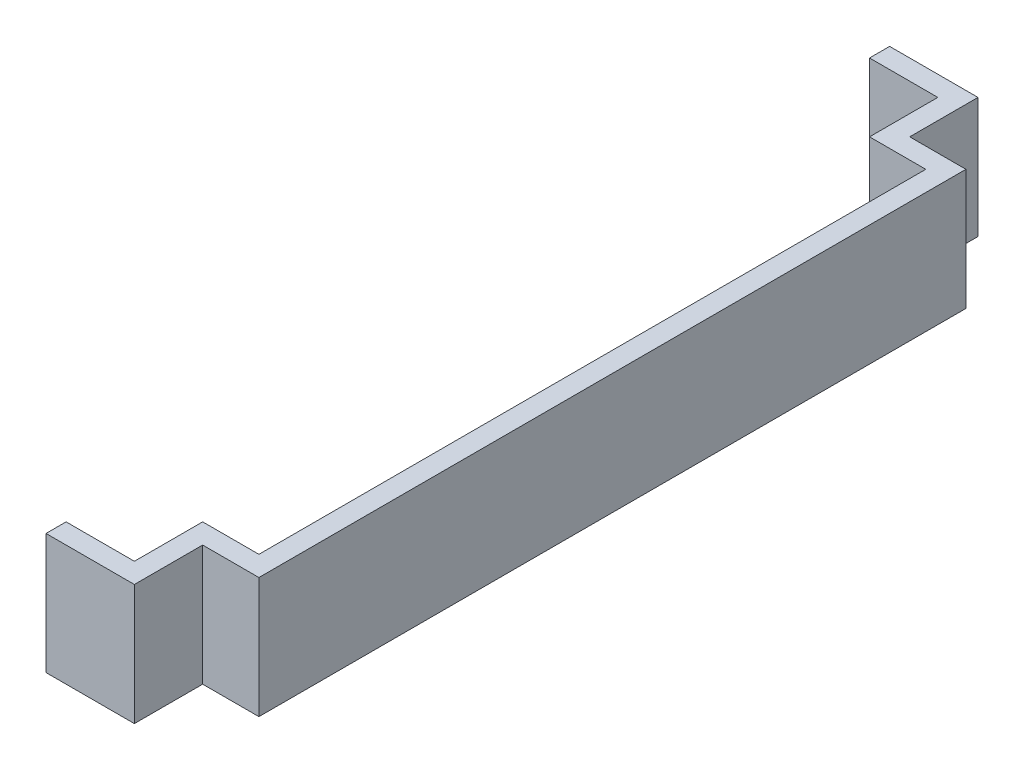
ISO-10303-21;
HEADER;
FILE_DESCRIPTION(('STEP AP214'),'2;1');
FILE_NAME('part.step','',(''),(''),'','','');
FILE_SCHEMA(('AUTOMOTIVE_DESIGN { 1 0 10303 214 1 1 1 1 }'));
ENDSEC;
DATA;
#1=APPLICATION_CONTEXT('core data for automotive mechanical design processes');
#2=APPLICATION_PROTOCOL_DEFINITION('international standard','automotive_design',2000,#1);
#3=PRODUCT_CONTEXT('',#1,'mechanical');
#4=PRODUCT('Part','Part','',(#3));
#5=PRODUCT_RELATED_PRODUCT_CATEGORY('part','',(#4));
#6=PRODUCT_DEFINITION_FORMATION('','',#4);
#7=PRODUCT_DEFINITION_CONTEXT('part definition',#1,'design');
#8=PRODUCT_DEFINITION('design','',#6,#7);
#9=PRODUCT_DEFINITION_SHAPE('','',#8);
#10=(LENGTH_UNIT() NAMED_UNIT(*) SI_UNIT(.MILLI.,.METRE.));
#11=(NAMED_UNIT(*) PLANE_ANGLE_UNIT() SI_UNIT($,.RADIAN.));
#12=(NAMED_UNIT(*) SI_UNIT($,.STERADIAN.) SOLID_ANGLE_UNIT());
#13=UNCERTAINTY_MEASURE_WITH_UNIT(LENGTH_MEASURE(1.E-05),#10,'distance_accuracy_value','');
#14=(GEOMETRIC_REPRESENTATION_CONTEXT(3) GLOBAL_UNCERTAINTY_ASSIGNED_CONTEXT((#13)) GLOBAL_UNIT_ASSIGNED_CONTEXT((#10,
#11,#12)) REPRESENTATION_CONTEXT('',''));
#15=CARTESIAN_POINT('',(0.,0.,0.));
#16=DIRECTION('',(0.,0.,1.));
#17=DIRECTION('',(1.,0.,0.));
#18=AXIS2_PLACEMENT_3D('',#15,#16,#17);
#19=CARTESIAN_POINT('',(2.50000000000001,15.,44.));
#20=DIRECTION('',(0.,0.,-1.));
#21=DIRECTION('',(-1.,0.,0.));
#22=AXIS2_PLACEMENT_3D('',#19,#20,#21);
#23=PLANE('',#22);
#24=DIRECTION('',(1.,0.,0.));
#25=VECTOR('',#24,1.);
#26=CARTESIAN_POINT('',(2.50000000000001,0.,44.));
#27=LINE('',#26,#25);
#28=CARTESIAN_POINT('',(-4.5,0.,44.));
#29=VERTEX_POINT('',#28);
#30=CARTESIAN_POINT('',(2.50000000000001,0.,44.));
#31=VERTEX_POINT('',#30);
#32=EDGE_CURVE('E176',#29,#31,#27,.T.);
#33=ORIENTED_EDGE('',*,*,#32,.T.);
#34=DIRECTION('',(0.,-1.,0.));
#35=VECTOR('',#34,1.);
#36=CARTESIAN_POINT('',(2.50000000000001,15.,44.));
#37=LINE('',#36,#35);
#38=CARTESIAN_POINT('',(2.50000000000001,15.,44.));
#39=VERTEX_POINT('',#38);
#40=EDGE_CURVE('E11',#39,#31,#37,.T.);
#41=ORIENTED_EDGE('',*,*,#40,.F.);
#42=DIRECTION('',(1.,0.,0.));
#43=VECTOR('',#42,1.);
#44=CARTESIAN_POINT('',(2.50000000000001,15.,44.));
#45=LINE('',#44,#43);
#46=CARTESIAN_POINT('',(-4.5,15.,44.));
#47=VERTEX_POINT('',#46);
#48=EDGE_CURVE('E206',#47,#39,#45,.T.);
#49=ORIENTED_EDGE('',*,*,#48,.F.);
#50=DIRECTION('',(0.,-1.,0.));
#51=VECTOR('',#50,1.);
#52=CARTESIAN_POINT('',(-4.5,15.,44.));
#53=LINE('',#52,#51);
#54=EDGE_CURVE('E172',#47,#29,#53,.T.);
#55=ORIENTED_EDGE('',*,*,#54,.T.);
#56=EDGE_LOOP('',(#33,#41,#49,#55));
#57=FACE_BOUND('',#56,.T.);
#58=ADVANCED_FACE('F32',(#57),#23,.F.);
#59=CARTESIAN_POINT('',(2.50000000000001,15.,-44.));
#60=DIRECTION('',(-1.,0.,0.));
#61=DIRECTION('',(0.,0.,1.));
#62=AXIS2_PLACEMENT_3D('',#59,#60,#61);
#63=PLANE('',#62);
#64=DIRECTION('',(0.,0.,-1.));
#65=VECTOR('',#64,1.);
#66=CARTESIAN_POINT('',(2.50000000000001,0.,-44.));
#67=LINE('',#66,#65);
#68=CARTESIAN_POINT('',(2.50000000000001,0.,-44.));
#69=VERTEX_POINT('',#68);
#70=EDGE_CURVE('E179',#31,#69,#67,.T.);
#71=ORIENTED_EDGE('',*,*,#70,.T.);
#72=DIRECTION('',(0.,-1.,0.));
#73=VECTOR('',#72,1.);
#74=CARTESIAN_POINT('',(2.50000000000001,15.,-44.));
#75=LINE('',#74,#73);
#76=CARTESIAN_POINT('',(2.50000000000001,15.,-44.));
#77=VERTEX_POINT('',#76);
#78=EDGE_CURVE('E40',#77,#69,#75,.T.);
#79=ORIENTED_EDGE('',*,*,#78,.F.);
#80=DIRECTION('',(0.,0.,-1.));
#81=VECTOR('',#80,1.);
#82=CARTESIAN_POINT('',(2.50000000000001,15.,-44.));
#83=LINE('',#82,#81);
#84=EDGE_CURVE('E115',#39,#77,#83,.T.);
#85=ORIENTED_EDGE('',*,*,#84,.F.);
#86=ORIENTED_EDGE('',*,*,#40,.T.);
#87=EDGE_LOOP('',(#71,#79,#85,#86));
#88=FACE_BOUND('',#87,.T.);
#89=ADVANCED_FACE('F304',(#88),#63,.F.);
#90=CARTESIAN_POINT('',(2.50000000000001,15.,-44.));
#91=DIRECTION('',(0.,0.,1.));
#92=DIRECTION('',(1.,0.,0.));
#93=AXIS2_PLACEMENT_3D('',#90,#91,#92);
#94=PLANE('',#93);
#95=DIRECTION('',(-1.,0.,0.));
#96=VECTOR('',#95,1.);
#97=CARTESIAN_POINT('',(2.50000000000001,0.,-44.));
#98=LINE('',#97,#96);
#99=CARTESIAN_POINT('',(-4.5,0.,-44.));
#100=VERTEX_POINT('',#99);
#101=EDGE_CURVE('E181',#69,#100,#98,.T.);
#102=ORIENTED_EDGE('',*,*,#101,.T.);
#103=DIRECTION('',(0.,-1.,0.));
#104=VECTOR('',#103,1.);
#105=CARTESIAN_POINT('',(-4.5,15.,-44.));
#106=LINE('',#105,#104);
#107=CARTESIAN_POINT('',(-4.5,15.,-44.));
#108=VERTEX_POINT('',#107);
#109=EDGE_CURVE('E237',#108,#100,#106,.T.);
#110=ORIENTED_EDGE('',*,*,#109,.F.);
#111=DIRECTION('',(-1.,0.,0.));
#112=VECTOR('',#111,1.);
#113=CARTESIAN_POINT('',(2.50000000000001,15.,-44.));
#114=LINE('',#113,#112);
#115=EDGE_CURVE('E245',#77,#108,#114,.T.);
#116=ORIENTED_EDGE('',*,*,#115,.F.);
#117=ORIENTED_EDGE('',*,*,#78,.T.);
#118=EDGE_LOOP('',(#102,#110,#116,#117));
#119=FACE_BOUND('',#118,.T.);
#120=ADVANCED_FACE('F243',(#119),#94,.F.);
#121=CARTESIAN_POINT('',(-4.5,15.,-44.));
#122=DIRECTION('',(-1.,0.,0.));
#123=DIRECTION('',(0.,0.,1.));
#124=AXIS2_PLACEMENT_3D('',#121,#122,#123);
#125=PLANE('',#124);
#126=DIRECTION('',(0.,0.,-1.));
#127=VECTOR('',#126,1.);
#128=CARTESIAN_POINT('',(-4.5,0.,-44.));
#129=LINE('',#128,#127);
#130=CARTESIAN_POINT('',(-4.5,0.,-52.5));
#131=VERTEX_POINT('',#130);
#132=EDGE_CURVE('E183',#100,#131,#129,.T.);
#133=ORIENTED_EDGE('',*,*,#132,.T.);
#134=DIRECTION('',(0.,-1.,0.));
#135=VECTOR('',#134,1.);
#136=CARTESIAN_POINT('',(-4.5,15.,-52.5));
#137=LINE('',#136,#135);
#138=CARTESIAN_POINT('',(-4.5,15.,-52.5));
#139=VERTEX_POINT('',#138);
#140=EDGE_CURVE('E234',#139,#131,#137,.T.);
#141=ORIENTED_EDGE('',*,*,#140,.F.);
#142=DIRECTION('',(0.,0.,-1.));
#143=VECTOR('',#142,1.);
#144=CARTESIAN_POINT('',(-4.5,15.,-44.));
#145=LINE('',#144,#143);
#146=EDGE_CURVE('E263',#108,#139,#145,.T.);
#147=ORIENTED_EDGE('',*,*,#146,.F.);
#148=ORIENTED_EDGE('',*,*,#109,.T.);
#149=EDGE_LOOP('',(#133,#141,#147,#148));
#150=FACE_BOUND('',#149,.T.);
#151=ADVANCED_FACE('F254',(#150),#125,.F.);
#152=CARTESIAN_POINT('',(-4.5,15.,-52.5));
#153=DIRECTION('',(0.,0.,1.));
#154=DIRECTION('',(1.,0.,0.));
#155=AXIS2_PLACEMENT_3D('',#152,#153,#154);
#156=PLANE('',#155);
#157=DIRECTION('',(-1.,0.,0.));
#158=VECTOR('',#157,1.);
#159=CARTESIAN_POINT('',(-4.5,0.,-52.5));
#160=LINE('',#159,#158);
#161=CARTESIAN_POINT('',(-15.5,0.,-52.5));
#162=VERTEX_POINT('',#161);
#163=EDGE_CURVE('E185',#131,#162,#160,.T.);
#164=ORIENTED_EDGE('',*,*,#163,.T.);
#165=DIRECTION('',(0.,-1.,0.));
#166=VECTOR('',#165,1.);
#167=CARTESIAN_POINT('',(-15.5,15.,-52.5));
#168=LINE('',#167,#166);
#169=CARTESIAN_POINT('',(-15.5,15.,-52.5));
#170=VERTEX_POINT('',#169);
#171=EDGE_CURVE('E231',#170,#162,#168,.T.);
#172=ORIENTED_EDGE('',*,*,#171,.F.);
#173=DIRECTION('',(-1.,0.,0.));
#174=VECTOR('',#173,1.);
#175=CARTESIAN_POINT('',(-4.5,15.,-52.5));
#176=LINE('',#175,#174);
#177=EDGE_CURVE('E260',#139,#170,#176,.T.);
#178=ORIENTED_EDGE('',*,*,#177,.F.);
#179=ORIENTED_EDGE('',*,*,#140,.T.);
#180=EDGE_LOOP('',(#164,#172,#178,#179));
#181=FACE_BOUND('',#180,.T.);
#182=ADVANCED_FACE('F258',(#181),#156,.F.);
#183=CARTESIAN_POINT('',(-15.5,15.,-50.));
#184=DIRECTION('',(1.,0.,0.));
#185=DIRECTION('',(0.,0.,-1.));
#186=AXIS2_PLACEMENT_3D('',#183,#184,#185);
#187=PLANE('',#186);
#188=DIRECTION('',(0.,0.,1.));
#189=VECTOR('',#188,1.);
#190=CARTESIAN_POINT('',(-15.5,0.,-50.));
#191=LINE('',#190,#189);
#192=CARTESIAN_POINT('',(-15.5,0.,-50.));
#193=VERTEX_POINT('',#192);
#194=EDGE_CURVE('E187',#162,#193,#191,.T.);
#195=ORIENTED_EDGE('',*,*,#194,.T.);
#196=DIRECTION('',(0.,-1.,0.));
#197=VECTOR('',#196,1.);
#198=CARTESIAN_POINT('',(-15.5,15.,-50.));
#199=LINE('',#198,#197);
#200=CARTESIAN_POINT('',(-15.5,15.,-50.));
#201=VERTEX_POINT('',#200);
#202=EDGE_CURVE('E228',#201,#193,#199,.T.);
#203=ORIENTED_EDGE('',*,*,#202,.F.);
#204=DIRECTION('',(0.,0.,1.));
#205=VECTOR('',#204,1.);
#206=CARTESIAN_POINT('',(-15.5,15.,-50.));
#207=LINE('',#206,#205);
#208=EDGE_CURVE('E262',#170,#201,#207,.T.);
#209=ORIENTED_EDGE('',*,*,#208,.F.);
#210=ORIENTED_EDGE('',*,*,#171,.T.);
#211=EDGE_LOOP('',(#195,#203,#209,#210));
#212=FACE_BOUND('',#211,.T.);
#213=ADVANCED_FACE('F317',(#212),#187,.F.);
#214=CARTESIAN_POINT('',(-7.,15.,-50.));
#215=DIRECTION('',(0.,0.,-1.));
#216=DIRECTION('',(-1.,0.,0.));
#217=AXIS2_PLACEMENT_3D('',#214,#215,#216);
#218=PLANE('',#217);
#219=DIRECTION('',(1.,0.,0.));
#220=VECTOR('',#219,1.);
#221=CARTESIAN_POINT('',(-7.,0.,-50.));
#222=LINE('',#221,#220);
#223=CARTESIAN_POINT('',(-7.,0.,-50.));
#224=VERTEX_POINT('',#223);
#225=EDGE_CURVE('E189',#193,#224,#222,.T.);
#226=ORIENTED_EDGE('',*,*,#225,.T.);
#227=DIRECTION('',(0.,-1.,0.));
#228=VECTOR('',#227,1.);
#229=CARTESIAN_POINT('',(-7.,15.,-50.));
#230=LINE('',#229,#228);
#231=CARTESIAN_POINT('',(-7.,15.,-50.));
#232=VERTEX_POINT('',#231);
#233=EDGE_CURVE('E225',#232,#224,#230,.T.);
#234=ORIENTED_EDGE('',*,*,#233,.F.);
#235=DIRECTION('',(1.,0.,0.));
#236=VECTOR('',#235,1.);
#237=CARTESIAN_POINT('',(-7.,15.,-50.));
#238=LINE('',#237,#236);
#239=EDGE_CURVE('E265',#201,#232,#238,.T.);
#240=ORIENTED_EDGE('',*,*,#239,.F.);
#241=ORIENTED_EDGE('',*,*,#202,.T.);
#242=EDGE_LOOP('',(#226,#234,#240,#241));
#243=FACE_BOUND('',#242,.T.);
#244=ADVANCED_FACE('F320',(#243),#218,.F.);
#245=CARTESIAN_POINT('',(-7.,15.,-41.5));
#246=DIRECTION('',(1.,0.,0.));
#247=DIRECTION('',(0.,0.,-1.));
#248=AXIS2_PLACEMENT_3D('',#245,#246,#247);
#249=PLANE('',#248);
#250=DIRECTION('',(0.,0.,1.));
#251=VECTOR('',#250,1.);
#252=CARTESIAN_POINT('',(-7.,0.,-41.5));
#253=LINE('',#252,#251);
#254=CARTESIAN_POINT('',(-7.,0.,-41.5));
#255=VERTEX_POINT('',#254);
#256=EDGE_CURVE('E191',#224,#255,#253,.T.);
#257=ORIENTED_EDGE('',*,*,#256,.T.);
#258=DIRECTION('',(0.,-1.,0.));
#259=VECTOR('',#258,1.);
#260=CARTESIAN_POINT('',(-7.,15.,-41.5));
#261=LINE('',#260,#259);
#262=CARTESIAN_POINT('',(-7.,15.,-41.5));
#263=VERTEX_POINT('',#262);
#264=EDGE_CURVE('E222',#263,#255,#261,.T.);
#265=ORIENTED_EDGE('',*,*,#264,.F.);
#266=DIRECTION('',(0.,0.,1.));
#267=VECTOR('',#266,1.);
#268=CARTESIAN_POINT('',(-7.,15.,-41.5));
#269=LINE('',#268,#267);
#270=EDGE_CURVE('E271',#232,#263,#269,.T.);
#271=ORIENTED_EDGE('',*,*,#270,.F.);
#272=ORIENTED_EDGE('',*,*,#233,.T.);
#273=EDGE_LOOP('',(#257,#265,#271,#272));
#274=FACE_BOUND('',#273,.T.);
#275=ADVANCED_FACE('F324',(#274),#249,.F.);
#276=CARTESIAN_POINT('',(0.,15.,-41.5));
#277=DIRECTION('',(0.,0.,-1.));
#278=DIRECTION('',(-1.,0.,0.));
#279=AXIS2_PLACEMENT_3D('',#276,#277,#278);
#280=PLANE('',#279);
#281=DIRECTION('',(1.,0.,0.));
#282=VECTOR('',#281,1.);
#283=CARTESIAN_POINT('',(0.,0.,-41.5));
#284=LINE('',#283,#282);
#285=CARTESIAN_POINT('',(0.,0.,-41.5));
#286=VERTEX_POINT('',#285);
#287=EDGE_CURVE('E193',#255,#286,#284,.T.);
#288=ORIENTED_EDGE('',*,*,#287,.T.);
#289=DIRECTION('',(0.,-1.,0.));
#290=VECTOR('',#289,1.);
#291=CARTESIAN_POINT('',(0.,15.,-41.5));
#292=LINE('',#291,#290);
#293=CARTESIAN_POINT('',(0.,15.,-41.5));
#294=VERTEX_POINT('',#293);
#295=EDGE_CURVE('E219',#294,#286,#292,.T.);
#296=ORIENTED_EDGE('',*,*,#295,.F.);
#297=DIRECTION('',(1.,0.,0.));
#298=VECTOR('',#297,1.);
#299=CARTESIAN_POINT('',(0.,15.,-41.5));
#300=LINE('',#299,#298);
#301=EDGE_CURVE('E273',#263,#294,#300,.T.);
#302=ORIENTED_EDGE('',*,*,#301,.F.);
#303=ORIENTED_EDGE('',*,*,#264,.T.);
#304=EDGE_LOOP('',(#288,#296,#302,#303));
#305=FACE_BOUND('',#304,.T.);
#306=ADVANCED_FACE('F328',(#305),#280,.F.);
#307=CARTESIAN_POINT('',(0.,15.,41.5));
#308=DIRECTION('',(1.,0.,0.));
#309=DIRECTION('',(0.,0.,-1.));
#310=AXIS2_PLACEMENT_3D('',#307,#308,#309);
#311=PLANE('',#310);
#312=DIRECTION('',(0.,0.,1.));
#313=VECTOR('',#312,1.);
#314=CARTESIAN_POINT('',(0.,0.,41.5));
#315=LINE('',#314,#313);
#316=CARTESIAN_POINT('',(0.,0.,41.5));
#317=VERTEX_POINT('',#316);
#318=EDGE_CURVE('E195',#286,#317,#315,.T.);
#319=ORIENTED_EDGE('',*,*,#318,.T.);
#320=DIRECTION('',(0.,-1.,0.));
#321=VECTOR('',#320,1.);
#322=CARTESIAN_POINT('',(0.,15.,41.5));
#323=LINE('',#322,#321);
#324=CARTESIAN_POINT('',(0.,15.,41.5));
#325=VERTEX_POINT('',#324);
#326=EDGE_CURVE('E216',#325,#317,#323,.T.);
#327=ORIENTED_EDGE('',*,*,#326,.F.);
#328=DIRECTION('',(0.,0.,1.));
#329=VECTOR('',#328,1.);
#330=CARTESIAN_POINT('',(0.,15.,41.5));
#331=LINE('',#330,#329);
#332=EDGE_CURVE('E275',#294,#325,#331,.T.);
#333=ORIENTED_EDGE('',*,*,#332,.F.);
#334=ORIENTED_EDGE('',*,*,#295,.T.);
#335=EDGE_LOOP('',(#319,#327,#333,#334));
#336=FACE_BOUND('',#335,.T.);
#337=ADVANCED_FACE('F332',(#336),#311,.F.);
#338=CARTESIAN_POINT('',(0.,15.,41.5));
#339=DIRECTION('',(0.,0.,1.));
#340=DIRECTION('',(1.,0.,0.));
#341=AXIS2_PLACEMENT_3D('',#338,#339,#340);
#342=PLANE('',#341);
#343=DIRECTION('',(-1.,0.,0.));
#344=VECTOR('',#343,1.);
#345=CARTESIAN_POINT('',(0.,0.,41.5));
#346=LINE('',#345,#344);
#347=CARTESIAN_POINT('',(-7.,0.,41.5));
#348=VERTEX_POINT('',#347);
#349=EDGE_CURVE('E197',#317,#348,#346,.T.);
#350=ORIENTED_EDGE('',*,*,#349,.T.);
#351=DIRECTION('',(0.,-1.,0.));
#352=VECTOR('',#351,1.);
#353=CARTESIAN_POINT('',(-7.,15.,41.5));
#354=LINE('',#353,#352);
#355=CARTESIAN_POINT('',(-7.,15.,41.5));
#356=VERTEX_POINT('',#355);
#357=EDGE_CURVE('E213',#356,#348,#354,.T.);
#358=ORIENTED_EDGE('',*,*,#357,.F.);
#359=DIRECTION('',(-1.,0.,0.));
#360=VECTOR('',#359,1.);
#361=CARTESIAN_POINT('',(0.,15.,41.5));
#362=LINE('',#361,#360);
#363=EDGE_CURVE('E277',#325,#356,#362,.T.);
#364=ORIENTED_EDGE('',*,*,#363,.F.);
#365=ORIENTED_EDGE('',*,*,#326,.T.);
#366=EDGE_LOOP('',(#350,#358,#364,#365));
#367=FACE_BOUND('',#366,.T.);
#368=ADVANCED_FACE('F336',(#367),#342,.F.);
#369=CARTESIAN_POINT('',(-7.,15.,41.5));
#370=DIRECTION('',(1.,0.,0.));
#371=DIRECTION('',(0.,0.,-1.));
#372=AXIS2_PLACEMENT_3D('',#369,#370,#371);
#373=PLANE('',#372);
#374=DIRECTION('',(0.,0.,1.));
#375=VECTOR('',#374,1.);
#376=CARTESIAN_POINT('',(-7.,0.,41.5));
#377=LINE('',#376,#375);
#378=CARTESIAN_POINT('',(-7.,0.,50.));
#379=VERTEX_POINT('',#378);
#380=EDGE_CURVE('E199',#348,#379,#377,.T.);
#381=ORIENTED_EDGE('',*,*,#380,.T.);
#382=DIRECTION('',(0.,-1.,0.));
#383=VECTOR('',#382,1.);
#384=CARTESIAN_POINT('',(-7.,15.,50.));
#385=LINE('',#384,#383);
#386=CARTESIAN_POINT('',(-7.,15.,50.));
#387=VERTEX_POINT('',#386);
#388=EDGE_CURVE('E210',#387,#379,#385,.T.);
#389=ORIENTED_EDGE('',*,*,#388,.F.);
#390=DIRECTION('',(0.,0.,1.));
#391=VECTOR('',#390,1.);
#392=CARTESIAN_POINT('',(-7.,15.,41.5));
#393=LINE('',#392,#391);
#394=EDGE_CURVE('E279',#356,#387,#393,.T.);
#395=ORIENTED_EDGE('',*,*,#394,.F.);
#396=ORIENTED_EDGE('',*,*,#357,.T.);
#397=EDGE_LOOP('',(#381,#389,#395,#396));
#398=FACE_BOUND('',#397,.T.);
#399=ADVANCED_FACE('F285',(#398),#373,.F.);
#400=CARTESIAN_POINT('',(-7.,15.,50.));
#401=DIRECTION('',(0.,0.,1.));
#402=DIRECTION('',(1.,0.,0.));
#403=AXIS2_PLACEMENT_3D('',#400,#401,#402);
#404=PLANE('',#403);
#405=DIRECTION('',(-1.,0.,0.));
#406=VECTOR('',#405,1.);
#407=CARTESIAN_POINT('',(-7.,0.,50.));
#408=LINE('',#407,#406);
#409=CARTESIAN_POINT('',(-15.5,0.,50.));
#410=VERTEX_POINT('',#409);
#411=EDGE_CURVE('E201',#379,#410,#408,.T.);
#412=ORIENTED_EDGE('',*,*,#411,.T.);
#413=DIRECTION('',(0.,-1.,0.));
#414=VECTOR('',#413,1.);
#415=CARTESIAN_POINT('',(-15.5,15.,50.));
#416=LINE('',#415,#414);
#417=CARTESIAN_POINT('',(-15.5,15.,50.));
#418=VERTEX_POINT('',#417);
#419=EDGE_CURVE('E167',#418,#410,#416,.T.);
#420=ORIENTED_EDGE('',*,*,#419,.F.);
#421=DIRECTION('',(-1.,0.,0.));
#422=VECTOR('',#421,1.);
#423=CARTESIAN_POINT('',(-7.,15.,50.));
#424=LINE('',#423,#422);
#425=EDGE_CURVE('E158',#387,#418,#424,.T.);
#426=ORIENTED_EDGE('',*,*,#425,.F.);
#427=ORIENTED_EDGE('',*,*,#388,.T.);
#428=EDGE_LOOP('',(#412,#420,#426,#427));
#429=FACE_BOUND('',#428,.T.);
#430=ADVANCED_FACE('F289',(#429),#404,.F.);
#431=CARTESIAN_POINT('',(-15.5,15.,50.));
#432=DIRECTION('',(1.,0.,0.));
#433=DIRECTION('',(0.,0.,-1.));
#434=AXIS2_PLACEMENT_3D('',#431,#432,#433);
#435=PLANE('',#434);
#436=DIRECTION('',(0.,0.,1.));
#437=VECTOR('',#436,1.);
#438=CARTESIAN_POINT('',(-15.5,0.,50.));
#439=LINE('',#438,#437);
#440=CARTESIAN_POINT('',(-15.5,0.,52.5));
#441=VERTEX_POINT('',#440);
#442=EDGE_CURVE('E166',#410,#441,#439,.T.);
#443=ORIENTED_EDGE('',*,*,#442,.T.);
#444=DIRECTION('',(0.,-1.,0.));
#445=VECTOR('',#444,1.);
#446=CARTESIAN_POINT('',(-15.5,15.,52.5));
#447=LINE('',#446,#445);
#448=CARTESIAN_POINT('',(-15.5,15.,52.5));
#449=VERTEX_POINT('',#448);
#450=EDGE_CURVE('E163',#449,#441,#447,.T.);
#451=ORIENTED_EDGE('',*,*,#450,.F.);
#452=DIRECTION('',(0.,0.,1.));
#453=VECTOR('',#452,1.);
#454=CARTESIAN_POINT('',(-15.5,15.,50.));
#455=LINE('',#454,#453);
#456=EDGE_CURVE('E152',#418,#449,#455,.T.);
#457=ORIENTED_EDGE('',*,*,#456,.F.);
#458=ORIENTED_EDGE('',*,*,#419,.T.);
#459=EDGE_LOOP('',(#443,#451,#457,#458));
#460=FACE_BOUND('',#459,.T.);
#461=ADVANCED_FACE('F164',(#460),#435,.F.);
#462=CARTESIAN_POINT('',(-4.5,15.,52.5));
#463=DIRECTION('',(0.,0.,-1.));
#464=DIRECTION('',(-1.,0.,0.));
#465=AXIS2_PLACEMENT_3D('',#462,#463,#464);
#466=PLANE('',#465);
#467=DIRECTION('',(1.,0.,0.));
#468=VECTOR('',#467,1.);
#469=CARTESIAN_POINT('',(-4.5,0.,52.5));
#470=LINE('',#469,#468);
#471=CARTESIAN_POINT('',(-4.5,0.,52.5));
#472=VERTEX_POINT('',#471);
#473=EDGE_CURVE('E101',#441,#472,#470,.T.);
#474=ORIENTED_EDGE('',*,*,#473,.T.);
#475=DIRECTION('',(0.,-1.,0.));
#476=VECTOR('',#475,1.);
#477=CARTESIAN_POINT('',(-4.5,15.,52.5));
#478=LINE('',#477,#476);
#479=CARTESIAN_POINT('',(-4.5,15.,52.5));
#480=VERTEX_POINT('',#479);
#481=EDGE_CURVE('E168',#480,#472,#478,.T.);
#482=ORIENTED_EDGE('',*,*,#481,.F.);
#483=DIRECTION('',(1.,0.,0.));
#484=VECTOR('',#483,1.);
#485=CARTESIAN_POINT('',(-4.5,15.,52.5));
#486=LINE('',#485,#484);
#487=EDGE_CURVE('E156',#449,#480,#486,.T.);
#488=ORIENTED_EDGE('',*,*,#487,.F.);
#489=ORIENTED_EDGE('',*,*,#450,.T.);
#490=EDGE_LOOP('',(#474,#482,#488,#489));
#491=FACE_BOUND('',#490,.T.);
#492=ADVANCED_FACE('F170',(#491),#466,.F.);
#493=CARTESIAN_POINT('',(-4.5,15.,44.));
#494=DIRECTION('',(-1.,0.,0.));
#495=DIRECTION('',(0.,0.,1.));
#496=AXIS2_PLACEMENT_3D('',#493,#494,#495);
#497=PLANE('',#496);
#498=DIRECTION('',(0.,0.,-1.));
#499=VECTOR('',#498,1.);
#500=CARTESIAN_POINT('',(-4.5,0.,44.));
#501=LINE('',#500,#499);
#502=EDGE_CURVE('E107',#472,#29,#501,.T.);
#503=ORIENTED_EDGE('',*,*,#502,.T.);
#504=ORIENTED_EDGE('',*,*,#54,.F.);
#505=DIRECTION('',(0.,0.,-1.));
#506=VECTOR('',#505,1.);
#507=CARTESIAN_POINT('',(-4.5,15.,44.));
#508=LINE('',#507,#506);
#509=EDGE_CURVE('E48',#480,#47,#508,.T.);
#510=ORIENTED_EDGE('',*,*,#509,.F.);
#511=ORIENTED_EDGE('',*,*,#481,.T.);
#512=EDGE_LOOP('',(#503,#504,#510,#511));
#513=FACE_BOUND('',#512,.T.);
#514=ADVANCED_FACE('F293',(#513),#497,.F.);
#515=CARTESIAN_POINT('',(0.,15.,0.));
#516=DIRECTION('',(0.,1.,0.));
#517=DIRECTION('',(0.,0.,1.));
#518=AXIS2_PLACEMENT_3D('',#515,#516,#517);
#519=PLANE('',#518);
#520=ORIENTED_EDGE('',*,*,#48,.T.);
#521=ORIENTED_EDGE('',*,*,#84,.T.);
#522=ORIENTED_EDGE('',*,*,#115,.T.);
#523=ORIENTED_EDGE('',*,*,#146,.T.);
#524=ORIENTED_EDGE('',*,*,#177,.T.);
#525=ORIENTED_EDGE('',*,*,#208,.T.);
#526=ORIENTED_EDGE('',*,*,#239,.T.);
#527=ORIENTED_EDGE('',*,*,#270,.T.);
#528=ORIENTED_EDGE('',*,*,#301,.T.);
#529=ORIENTED_EDGE('',*,*,#332,.T.);
#530=ORIENTED_EDGE('',*,*,#363,.T.);
#531=ORIENTED_EDGE('',*,*,#394,.T.);
#532=ORIENTED_EDGE('',*,*,#425,.T.);
#533=ORIENTED_EDGE('',*,*,#456,.T.);
#534=ORIENTED_EDGE('',*,*,#487,.T.);
#535=ORIENTED_EDGE('',*,*,#509,.T.);
#536=EDGE_LOOP('',(#520,#521,#522,#523,#524,#525,#526,#527,#528,#529,#530,#531,#532,#533,#534,#535));
#537=FACE_BOUND('',#536,.T.);
#538=ADVANCED_FACE('F154',(#537),#519,.T.);
#539=CARTESIAN_POINT('',(0.,0.,0.));
#540=DIRECTION('',(0.,1.,0.));
#541=DIRECTION('',(0.,0.,1.));
#542=AXIS2_PLACEMENT_3D('',#539,#540,#541);
#543=PLANE('',#542);
#544=ORIENTED_EDGE('',*,*,#32,.F.);
#545=ORIENTED_EDGE('',*,*,#502,.F.);
#546=ORIENTED_EDGE('',*,*,#473,.F.);
#547=ORIENTED_EDGE('',*,*,#442,.F.);
#548=ORIENTED_EDGE('',*,*,#411,.F.);
#549=ORIENTED_EDGE('',*,*,#380,.F.);
#550=ORIENTED_EDGE('',*,*,#349,.F.);
#551=ORIENTED_EDGE('',*,*,#318,.F.);
#552=ORIENTED_EDGE('',*,*,#287,.F.);
#553=ORIENTED_EDGE('',*,*,#256,.F.);
#554=ORIENTED_EDGE('',*,*,#225,.F.);
#555=ORIENTED_EDGE('',*,*,#194,.F.);
#556=ORIENTED_EDGE('',*,*,#163,.F.);
#557=ORIENTED_EDGE('',*,*,#132,.F.);
#558=ORIENTED_EDGE('',*,*,#101,.F.);
#559=ORIENTED_EDGE('',*,*,#70,.F.);
#560=EDGE_LOOP('',(#544,#545,#546,#547,#548,#549,#550,#551,#552,#553,#554,#555,#556,#557,#558,#559));
#561=FACE_BOUND('',#560,.T.);
#562=ADVANCED_FACE('F249',(#561),#543,.F.);
#563=CLOSED_SHELL('',(#58,#89,#120,#151,#182,#213,#244,#275,#306,#337,#368,#399,#430,#461,#492,
#514,#538,#562));
#564=MANIFOLD_SOLID_BREP('B2',#563);
#565=ADVANCED_BREP_SHAPE_REPRESENTATION('',(#18,#564),#14);
#566=SHAPE_DEFINITION_REPRESENTATION(#9,#565);
ENDSEC;
END-ISO-10303-21;
